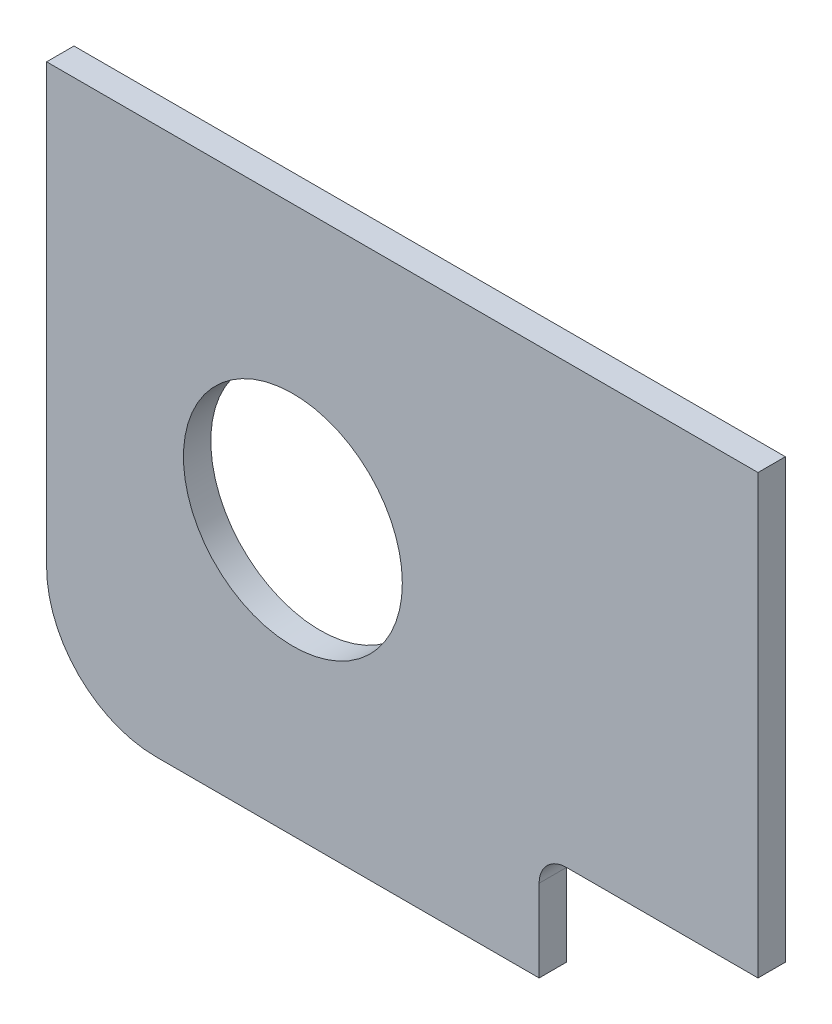
ISO-10303-21;
HEADER;
FILE_DESCRIPTION(('STEP AP214'),'2;1');
FILE_NAME('part.step','',(''),(''),'','','');
FILE_SCHEMA(('AUTOMOTIVE_DESIGN { 1 0 10303 214 1 1 1 1 }'));
ENDSEC;
DATA;
#1=APPLICATION_CONTEXT('core data for automotive mechanical design processes');
#2=APPLICATION_PROTOCOL_DEFINITION('international standard','automotive_design',2000,#1);
#3=PRODUCT_CONTEXT('',#1,'mechanical');
#4=PRODUCT('Part','Part','',(#3));
#5=PRODUCT_RELATED_PRODUCT_CATEGORY('part','',(#4));
#6=PRODUCT_DEFINITION_FORMATION('','',#4);
#7=PRODUCT_DEFINITION_CONTEXT('part definition',#1,'design');
#8=PRODUCT_DEFINITION('design','',#6,#7);
#9=PRODUCT_DEFINITION_SHAPE('','',#8);
#10=(LENGTH_UNIT() NAMED_UNIT(*) SI_UNIT(.MILLI.,.METRE.));
#11=(NAMED_UNIT(*) PLANE_ANGLE_UNIT() SI_UNIT($,.RADIAN.));
#12=(NAMED_UNIT(*) SI_UNIT($,.STERADIAN.) SOLID_ANGLE_UNIT());
#13=UNCERTAINTY_MEASURE_WITH_UNIT(LENGTH_MEASURE(1.E-05),#10,'distance_accuracy_value','');
#14=(GEOMETRIC_REPRESENTATION_CONTEXT(3) GLOBAL_UNCERTAINTY_ASSIGNED_CONTEXT((#13)) GLOBAL_UNIT_ASSIGNED_CONTEXT((#10,
#11,#12)) REPRESENTATION_CONTEXT('',''));
#15=CARTESIAN_POINT('',(0.,0.,0.));
#16=DIRECTION('',(0.,0.,1.));
#17=DIRECTION('',(1.,0.,0.));
#18=AXIS2_PLACEMENT_3D('',#15,#16,#17);
#19=CARTESIAN_POINT('',(95.,15.,5.));
#20=DIRECTION('',(0.,0.,1.));
#21=DIRECTION('',(1.,0.,0.));
#22=AXIS2_PLACEMENT_3D('',#19,#20,#21);
#23=PLANE('',#22);
#24=DIRECTION('',(0.,1.,0.));
#25=VECTOR('',#24,1.);
#26=CARTESIAN_POINT('',(90.,0.,5.));
#27=LINE('',#26,#25);
#28=CARTESIAN_POINT('',(90.,0.,5.));
#29=VERTEX_POINT('',#28);
#30=CARTESIAN_POINT('',(90.,15.,5.));
#31=VERTEX_POINT('',#30);
#32=EDGE_CURVE('E164',#29,#31,#27,.T.);
#33=ORIENTED_EDGE('',*,*,#32,.T.);
#34=CARTESIAN_POINT('',(95.,15.,5.));
#35=DIRECTION('',(0.,0.,-1.));
#36=DIRECTION('',(1.,0.,0.));
#37=AXIS2_PLACEMENT_3D('',#34,#35,#36);
#38=CIRCLE('',#37,5.);
#39=CARTESIAN_POINT('',(95.,20.,5.));
#40=VERTEX_POINT('',#39);
#41=EDGE_CURVE('E100',#31,#40,#38,.T.);
#42=ORIENTED_EDGE('',*,*,#41,.T.);
#43=DIRECTION('',(1.,0.,0.));
#44=VECTOR('',#43,1.);
#45=CARTESIAN_POINT('',(95.,20.,5.));
#46=LINE('',#45,#44);
#47=CARTESIAN_POINT('',(130.,20.,5.));
#48=VERTEX_POINT('',#47);
#49=EDGE_CURVE('E185',#40,#48,#46,.T.);
#50=ORIENTED_EDGE('',*,*,#49,.T.);
#51=DIRECTION('',(0.,1.,0.));
#52=VECTOR('',#51,1.);
#53=CARTESIAN_POINT('',(130.,20.,5.));
#54=LINE('',#53,#52);
#55=CARTESIAN_POINT('',(130.,100.,5.));
#56=VERTEX_POINT('',#55);
#57=EDGE_CURVE('E199',#48,#56,#54,.T.);
#58=ORIENTED_EDGE('',*,*,#57,.T.);
#59=DIRECTION('',(-1.,0.,0.));
#60=VECTOR('',#59,1.);
#61=CARTESIAN_POINT('',(130.,100.,5.));
#62=LINE('',#61,#60);
#63=CARTESIAN_POINT('',(0.,100.,5.));
#64=VERTEX_POINT('',#63);
#65=EDGE_CURVE('E119',#56,#64,#62,.T.);
#66=ORIENTED_EDGE('',*,*,#65,.T.);
#67=DIRECTION('',(0.,-1.,0.));
#68=VECTOR('',#67,1.);
#69=CARTESIAN_POINT('',(0.,100.,5.));
#70=LINE('',#69,#68);
#71=CARTESIAN_POINT('',(0.,20.,5.));
#72=VERTEX_POINT('',#71);
#73=EDGE_CURVE('E113',#64,#72,#70,.T.);
#74=ORIENTED_EDGE('',*,*,#73,.T.);
#75=CARTESIAN_POINT('',(20.,20.,5.));
#76=DIRECTION('',(0.,0.,1.));
#77=DIRECTION('',(-1.,0.,0.));
#78=AXIS2_PLACEMENT_3D('',#75,#76,#77);
#79=CIRCLE('',#78,20.);
#80=CARTESIAN_POINT('',(20.0000000000001,0.,5.));
#81=VERTEX_POINT('',#80);
#82=EDGE_CURVE('E117',#72,#81,#79,.T.);
#83=ORIENTED_EDGE('',*,*,#82,.T.);
#84=DIRECTION('',(1.,0.,0.));
#85=VECTOR('',#84,1.);
#86=CARTESIAN_POINT('',(20.0000000000001,0.,5.));
#87=LINE('',#86,#85);
#88=EDGE_CURVE('E57',#81,#29,#87,.T.);
#89=ORIENTED_EDGE('',*,*,#88,.T.);
#90=EDGE_LOOP('',(#33,#42,#50,#58,#66,#74,#83,#89));
#91=FACE_BOUND('',#90,.T.);
#92=CARTESIAN_POINT('',(45.,50.,5.));
#93=DIRECTION('',(0.,0.,1.));
#94=DIRECTION('',(1.,0.,0.));
#95=AXIS2_PLACEMENT_3D('',#92,#93,#94);
#96=CIRCLE('',#95,20.);
#97=CARTESIAN_POINT('',(65.,50.,5.));
#98=VERTEX_POINT('',#97);
#99=EDGE_CURVE('E146',#98,#98,#96,.T.);
#100=ORIENTED_EDGE('',*,*,#99,.F.);
#101=EDGE_LOOP('',(#100));
#102=FACE_BOUND('',#101,.T.);
#103=ADVANCED_FACE('F39',(#91,#102),#23,.T.);
#104=CARTESIAN_POINT('',(95.,15.,0.));
#105=DIRECTION('',(0.,0.,1.));
#106=DIRECTION('',(1.,0.,0.));
#107=AXIS2_PLACEMENT_3D('',#104,#105,#106);
#108=PLANE('',#107);
#109=DIRECTION('',(0.,1.,0.));
#110=VECTOR('',#109,1.);
#111=CARTESIAN_POINT('',(90.,0.,0.));
#112=LINE('',#111,#110);
#113=CARTESIAN_POINT('',(90.,0.,0.));
#114=VERTEX_POINT('',#113);
#115=CARTESIAN_POINT('',(90.,15.,0.));
#116=VERTEX_POINT('',#115);
#117=EDGE_CURVE('E141',#114,#116,#112,.T.);
#118=ORIENTED_EDGE('',*,*,#117,.F.);
#119=DIRECTION('',(1.,0.,0.));
#120=VECTOR('',#119,1.);
#121=CARTESIAN_POINT('',(20.0000000000001,0.,0.));
#122=LINE('',#121,#120);
#123=CARTESIAN_POINT('',(20.0000000000001,0.,0.));
#124=VERTEX_POINT('',#123);
#125=EDGE_CURVE('E92',#124,#114,#122,.T.);
#126=ORIENTED_EDGE('',*,*,#125,.F.);
#127=CARTESIAN_POINT('',(20.,20.,0.));
#128=DIRECTION('',(0.,0.,1.));
#129=DIRECTION('',(-1.,0.,0.));
#130=AXIS2_PLACEMENT_3D('',#127,#128,#129);
#131=CIRCLE('',#130,20.);
#132=CARTESIAN_POINT('',(0.,20.,0.));
#133=VERTEX_POINT('',#132);
#134=EDGE_CURVE('E86',#133,#124,#131,.T.);
#135=ORIENTED_EDGE('',*,*,#134,.F.);
#136=DIRECTION('',(0.,-1.,0.));
#137=VECTOR('',#136,1.);
#138=CARTESIAN_POINT('',(0.,100.,0.));
#139=LINE('',#138,#137);
#140=CARTESIAN_POINT('',(0.,100.,0.));
#141=VERTEX_POINT('',#140);
#142=EDGE_CURVE('E128',#141,#133,#139,.T.);
#143=ORIENTED_EDGE('',*,*,#142,.F.);
#144=DIRECTION('',(-1.,0.,0.));
#145=VECTOR('',#144,1.);
#146=CARTESIAN_POINT('',(130.,100.,0.));
#147=LINE('',#146,#145);
#148=CARTESIAN_POINT('',(130.,100.,0.));
#149=VERTEX_POINT('',#148);
#150=EDGE_CURVE('E155',#149,#141,#147,.T.);
#151=ORIENTED_EDGE('',*,*,#150,.F.);
#152=DIRECTION('',(0.,1.,0.));
#153=VECTOR('',#152,1.);
#154=CARTESIAN_POINT('',(130.,20.,0.));
#155=LINE('',#154,#153);
#156=CARTESIAN_POINT('',(130.,20.,0.));
#157=VERTEX_POINT('',#156);
#158=EDGE_CURVE('E152',#157,#149,#155,.T.);
#159=ORIENTED_EDGE('',*,*,#158,.F.);
#160=DIRECTION('',(1.,0.,0.));
#161=VECTOR('',#160,1.);
#162=CARTESIAN_POINT('',(95.,20.,0.));
#163=LINE('',#162,#161);
#164=CARTESIAN_POINT('',(95.,20.,0.));
#165=VERTEX_POINT('',#164);
#166=EDGE_CURVE('E149',#165,#157,#163,.T.);
#167=ORIENTED_EDGE('',*,*,#166,.F.);
#168=CARTESIAN_POINT('',(95.,15.,0.));
#169=DIRECTION('',(0.,0.,-1.));
#170=DIRECTION('',(1.,0.,0.));
#171=AXIS2_PLACEMENT_3D('',#168,#169,#170);
#172=CIRCLE('',#171,5.);
#173=EDGE_CURVE('E145',#116,#165,#172,.T.);
#174=ORIENTED_EDGE('',*,*,#173,.F.);
#175=EDGE_LOOP('',(#118,#126,#135,#143,#151,#159,#167,#174));
#176=FACE_BOUND('',#175,.T.);
#177=CARTESIAN_POINT('',(45.,50.,0.));
#178=DIRECTION('',(0.,0.,1.));
#179=DIRECTION('',(1.,0.,0.));
#180=AXIS2_PLACEMENT_3D('',#177,#178,#179);
#181=CIRCLE('',#180,20.);
#182=CARTESIAN_POINT('',(65.,50.,0.));
#183=VERTEX_POINT('',#182);
#184=EDGE_CURVE('E209',#183,#183,#181,.T.);
#185=ORIENTED_EDGE('',*,*,#184,.T.);
#186=EDGE_LOOP('',(#185));
#187=FACE_BOUND('',#186,.T.);
#188=ADVANCED_FACE('F189',(#176,#187),#108,.F.);
#189=CARTESIAN_POINT('',(90.,0.,5.));
#190=DIRECTION('',(-1.,0.,0.));
#191=DIRECTION('',(0.,0.,1.));
#192=AXIS2_PLACEMENT_3D('',#189,#190,#191);
#193=PLANE('',#192);
#194=ORIENTED_EDGE('',*,*,#117,.T.);
#195=DIRECTION('',(0.,0.,-1.));
#196=VECTOR('',#195,1.);
#197=CARTESIAN_POINT('',(90.,15.,5.));
#198=LINE('',#197,#196);
#199=EDGE_CURVE('E11',#31,#116,#198,.T.);
#200=ORIENTED_EDGE('',*,*,#199,.F.);
#201=ORIENTED_EDGE('',*,*,#32,.F.);
#202=DIRECTION('',(0.,0.,-1.));
#203=VECTOR('',#202,1.);
#204=CARTESIAN_POINT('',(90.,0.,5.));
#205=LINE('',#204,#203);
#206=EDGE_CURVE('E137',#29,#114,#205,.T.);
#207=ORIENTED_EDGE('',*,*,#206,.T.);
#208=EDGE_LOOP('',(#194,#200,#201,#207));
#209=FACE_BOUND('',#208,.T.);
#210=ADVANCED_FACE('F41',(#209),#193,.F.);
#211=CARTESIAN_POINT('',(95.,15.,5.));
#212=DIRECTION('',(0.,0.,-1.));
#213=DIRECTION('',(-1.,0.,0.));
#214=AXIS2_PLACEMENT_3D('',#211,#212,#213);
#215=CYLINDRICAL_SURFACE('',#214,5.);
#216=ORIENTED_EDGE('',*,*,#173,.T.);
#217=DIRECTION('',(0.,0.,-1.));
#218=VECTOR('',#217,1.);
#219=CARTESIAN_POINT('',(95.,20.,5.));
#220=LINE('',#219,#218);
#221=EDGE_CURVE('E49',#40,#165,#220,.T.);
#222=ORIENTED_EDGE('',*,*,#221,.F.);
#223=ORIENTED_EDGE('',*,*,#41,.F.);
#224=ORIENTED_EDGE('',*,*,#199,.T.);
#225=EDGE_LOOP('',(#216,#222,#223,#224));
#226=FACE_BOUND('',#225,.T.);
#227=ADVANCED_FACE('F239',(#226),#215,.F.);
#228=CARTESIAN_POINT('',(95.,20.,5.));
#229=DIRECTION('',(0.,1.,0.));
#230=DIRECTION('',(0.,0.,1.));
#231=AXIS2_PLACEMENT_3D('',#228,#229,#230);
#232=PLANE('',#231);
#233=ORIENTED_EDGE('',*,*,#166,.T.);
#234=DIRECTION('',(0.,0.,-1.));
#235=VECTOR('',#234,1.);
#236=CARTESIAN_POINT('',(130.,20.,5.));
#237=LINE('',#236,#235);
#238=EDGE_CURVE('E175',#48,#157,#237,.T.);
#239=ORIENTED_EDGE('',*,*,#238,.F.);
#240=ORIENTED_EDGE('',*,*,#49,.F.);
#241=ORIENTED_EDGE('',*,*,#221,.T.);
#242=EDGE_LOOP('',(#233,#239,#240,#241));
#243=FACE_BOUND('',#242,.T.);
#244=ADVANCED_FACE('F183',(#243),#232,.F.);
#245=CARTESIAN_POINT('',(130.,20.,5.));
#246=DIRECTION('',(-1.,0.,0.));
#247=DIRECTION('',(0.,0.,1.));
#248=AXIS2_PLACEMENT_3D('',#245,#246,#247);
#249=PLANE('',#248);
#250=ORIENTED_EDGE('',*,*,#158,.T.);
#251=DIRECTION('',(0.,0.,-1.));
#252=VECTOR('',#251,1.);
#253=CARTESIAN_POINT('',(130.,100.,5.));
#254=LINE('',#253,#252);
#255=EDGE_CURVE('E171',#56,#149,#254,.T.);
#256=ORIENTED_EDGE('',*,*,#255,.F.);
#257=ORIENTED_EDGE('',*,*,#57,.F.);
#258=ORIENTED_EDGE('',*,*,#238,.T.);
#259=EDGE_LOOP('',(#250,#256,#257,#258));
#260=FACE_BOUND('',#259,.T.);
#261=ADVANCED_FACE('F194',(#260),#249,.F.);
#262=CARTESIAN_POINT('',(130.,100.,5.));
#263=DIRECTION('',(0.,-1.,0.));
#264=DIRECTION('',(1.,0.,0.));
#265=AXIS2_PLACEMENT_3D('',#262,#263,#264);
#266=PLANE('',#265);
#267=ORIENTED_EDGE('',*,*,#150,.T.);
#268=DIRECTION('',(0.,0.,-1.));
#269=VECTOR('',#268,1.);
#270=CARTESIAN_POINT('',(0.,100.,5.));
#271=LINE('',#270,#269);
#272=EDGE_CURVE('E130',#64,#141,#271,.T.);
#273=ORIENTED_EDGE('',*,*,#272,.F.);
#274=ORIENTED_EDGE('',*,*,#65,.F.);
#275=ORIENTED_EDGE('',*,*,#255,.T.);
#276=EDGE_LOOP('',(#267,#273,#274,#275));
#277=FACE_BOUND('',#276,.T.);
#278=ADVANCED_FACE('F197',(#277),#266,.F.);
#279=CARTESIAN_POINT('',(0.,100.,5.));
#280=DIRECTION('',(1.,0.,0.));
#281=DIRECTION('',(0.,1.,0.));
#282=AXIS2_PLACEMENT_3D('',#279,#280,#281);
#283=PLANE('',#282);
#284=ORIENTED_EDGE('',*,*,#142,.T.);
#285=DIRECTION('',(0.,0.,-1.));
#286=VECTOR('',#285,1.);
#287=CARTESIAN_POINT('',(0.,20.,5.));
#288=LINE('',#287,#286);
#289=EDGE_CURVE('E125',#72,#133,#288,.T.);
#290=ORIENTED_EDGE('',*,*,#289,.F.);
#291=ORIENTED_EDGE('',*,*,#73,.F.);
#292=ORIENTED_EDGE('',*,*,#272,.T.);
#293=EDGE_LOOP('',(#284,#290,#291,#292));
#294=FACE_BOUND('',#293,.T.);
#295=ADVANCED_FACE('F126',(#294),#283,.F.);
#296=CARTESIAN_POINT('',(20.,20.,5.));
#297=DIRECTION('',(0.,0.,-1.));
#298=DIRECTION('',(-1.,0.,0.));
#299=AXIS2_PLACEMENT_3D('',#296,#297,#298);
#300=CYLINDRICAL_SURFACE('',#299,20.);
#301=ORIENTED_EDGE('',*,*,#134,.T.);
#302=DIRECTION('',(0.,0.,-1.));
#303=VECTOR('',#302,1.);
#304=CARTESIAN_POINT('',(20.0000000000001,0.,5.));
#305=LINE('',#304,#303);
#306=EDGE_CURVE('E131',#81,#124,#305,.T.);
#307=ORIENTED_EDGE('',*,*,#306,.F.);
#308=ORIENTED_EDGE('',*,*,#82,.F.);
#309=ORIENTED_EDGE('',*,*,#289,.T.);
#310=EDGE_LOOP('',(#301,#307,#308,#309));
#311=FACE_BOUND('',#310,.T.);
#312=ADVANCED_FACE('F133',(#311),#300,.T.);
#313=CARTESIAN_POINT('',(20.0000000000001,0.,5.));
#314=DIRECTION('',(0.,1.,0.));
#315=DIRECTION('',(0.,0.,1.));
#316=AXIS2_PLACEMENT_3D('',#313,#314,#315);
#317=PLANE('',#316);
#318=ORIENTED_EDGE('',*,*,#125,.T.);
#319=ORIENTED_EDGE('',*,*,#206,.F.);
#320=ORIENTED_EDGE('',*,*,#88,.F.);
#321=ORIENTED_EDGE('',*,*,#306,.T.);
#322=EDGE_LOOP('',(#318,#319,#320,#321));
#323=FACE_BOUND('',#322,.T.);
#324=ADVANCED_FACE('F227',(#323),#317,.F.);
#325=CARTESIAN_POINT('',(45.,50.,5.));
#326=DIRECTION('',(0.,0.,-1.));
#327=DIRECTION('',(-1.,0.,0.));
#328=AXIS2_PLACEMENT_3D('',#325,#326,#327);
#329=CYLINDRICAL_SURFACE('',#328,20.);
#330=ORIENTED_EDGE('',*,*,#99,.T.);
#331=EDGE_LOOP('',(#330));
#332=FACE_BOUND('',#331,.T.);
#333=ORIENTED_EDGE('',*,*,#184,.F.);
#334=EDGE_LOOP('',(#333));
#335=FACE_BOUND('',#334,.T.);
#336=ADVANCED_FACE('F217',(#332,#335),#329,.F.);
#337=CLOSED_SHELL('',(#103,#188,#210,#227,#244,#261,#278,#295,#312,#324,#336));
#338=MANIFOLD_SOLID_BREP('B2',#337);
#339=ADVANCED_BREP_SHAPE_REPRESENTATION('',(#18,#338),#14);
#340=SHAPE_DEFINITION_REPRESENTATION(#9,#339);
ENDSEC;
END-ISO-10303-21;
